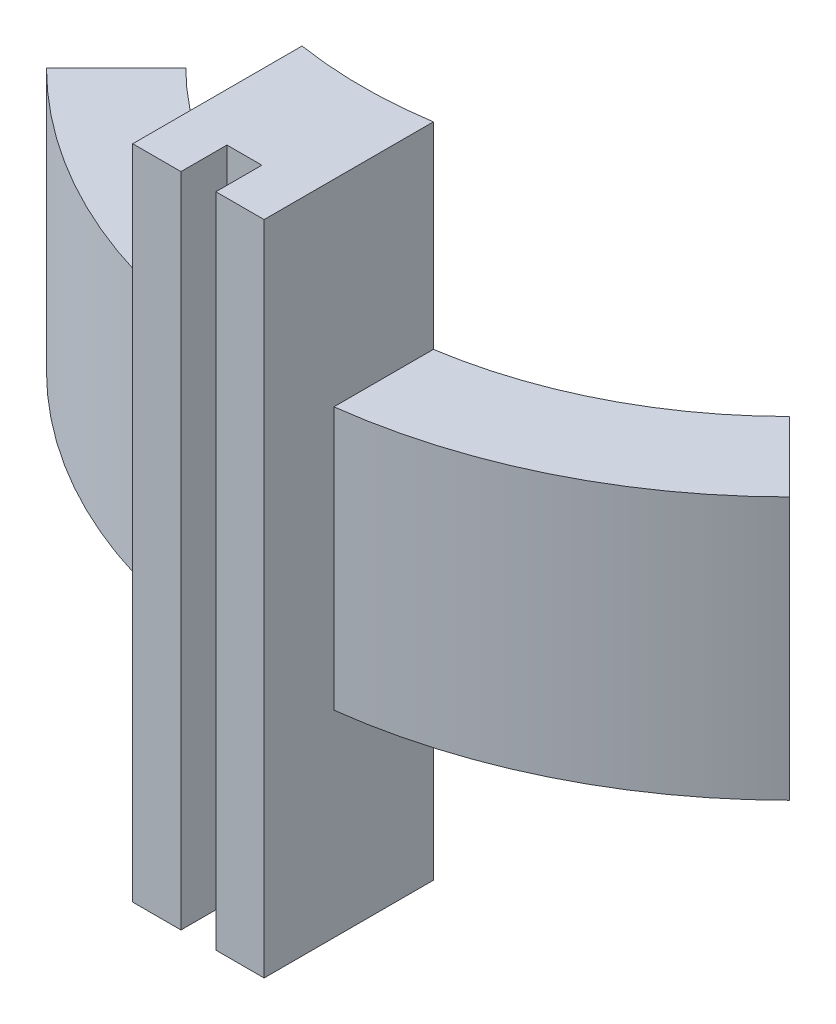
ISO-10303-21;
HEADER;
FILE_DESCRIPTION(('STEP AP214'),'2;1');
FILE_NAME('part.step','',(''),(''),'','','');
FILE_SCHEMA(('AUTOMOTIVE_DESIGN { 1 0 10303 214 1 1 1 1 }'));
ENDSEC;
DATA;
#1=APPLICATION_CONTEXT('core data for automotive mechanical design processes');
#2=APPLICATION_PROTOCOL_DEFINITION('international standard','automotive_design',2000,#1);
#3=PRODUCT_CONTEXT('',#1,'mechanical');
#4=PRODUCT('Part','Part','',(#3));
#5=PRODUCT_RELATED_PRODUCT_CATEGORY('part','',(#4));
#6=PRODUCT_DEFINITION_FORMATION('','',#4);
#7=PRODUCT_DEFINITION_CONTEXT('part definition',#1,'design');
#8=PRODUCT_DEFINITION('design','',#6,#7);
#9=PRODUCT_DEFINITION_SHAPE('','',#8);
#10=(LENGTH_UNIT() NAMED_UNIT(*) SI_UNIT(.MILLI.,.METRE.));
#11=(NAMED_UNIT(*) PLANE_ANGLE_UNIT() SI_UNIT($,.RADIAN.));
#12=(NAMED_UNIT(*) SI_UNIT($,.STERADIAN.) SOLID_ANGLE_UNIT());
#13=UNCERTAINTY_MEASURE_WITH_UNIT(LENGTH_MEASURE(1.E-05),#10,'distance_accuracy_value','');
#14=(GEOMETRIC_REPRESENTATION_CONTEXT(3) GLOBAL_UNCERTAINTY_ASSIGNED_CONTEXT((#13)) GLOBAL_UNIT_ASSIGNED_CONTEXT((#10,
#11,#12)) REPRESENTATION_CONTEXT('',''));
#15=CARTESIAN_POINT('',(0.,0.,0.));
#16=DIRECTION('',(0.,0.,1.));
#17=DIRECTION('',(1.,0.,0.));
#18=AXIS2_PLACEMENT_3D('',#15,#16,#17);
#19=CARTESIAN_POINT('',(0.,-10.,0.));
#20=DIRECTION('',(0.,1.,0.));
#21=DIRECTION('',(0.,0.,1.));
#22=AXIS2_PLACEMENT_3D('',#19,#20,#21);
#23=CYLINDRICAL_SURFACE('',#22,40.);
#24=CARTESIAN_POINT('',(0.,10.,0.));
#25=DIRECTION('',(0.,1.,0.));
#26=DIRECTION('',(0.,0.,1.));
#27=AXIS2_PLACEMENT_3D('',#24,#25,#26);
#28=CIRCLE('',#27,40.);
#29=CARTESIAN_POINT('',(5.,10.,39.6862696659689));
#30=VERTEX_POINT('',#29);
#31=CARTESIAN_POINT('',(28.2842732378177,10.,28.284269257106));
#32=VERTEX_POINT('',#31);
#33=EDGE_CURVE('E284',#30,#32,#28,.T.);
#34=ORIENTED_EDGE('',*,*,#33,.F.);
#35=DIRECTION('',(0.,1.,0.));
#36=VECTOR('',#35,1.);
#37=CARTESIAN_POINT('',(5.,-10.,39.6862696659689));
#38=LINE('',#37,#36);
#39=CARTESIAN_POINT('',(5.,-10.,39.6862696659689));
#40=VERTEX_POINT('',#39);
#41=EDGE_CURVE('E269',#30,#40,#38,.F.);
#42=ORIENTED_EDGE('',*,*,#41,.T.);
#43=CARTESIAN_POINT('',(0.,-10.,0.));
#44=DIRECTION('',(0.,1.,0.));
#45=DIRECTION('',(0.,0.,1.));
#46=AXIS2_PLACEMENT_3D('',#43,#44,#45);
#47=CIRCLE('',#46,40.);
#48=CARTESIAN_POINT('',(28.2842732378177,-10.,28.284269257106));
#49=VERTEX_POINT('',#48);
#50=EDGE_CURVE('E300',#40,#49,#47,.T.);
#51=ORIENTED_EDGE('',*,*,#50,.T.);
#52=DIRECTION('',(0.,1.,0.));
#53=VECTOR('',#52,1.);
#54=CARTESIAN_POINT('',(28.2842732378177,-10.,28.284269257106));
#55=LINE('',#54,#53);
#56=EDGE_CURVE('E314',#49,#32,#55,.T.);
#57=ORIENTED_EDGE('',*,*,#56,.T.);
#58=EDGE_LOOP('',(#34,#42,#51,#57));
#59=FACE_BOUND('',#58,.T.);
#60=ADVANCED_FACE('F49',(#59),#23,.T.);
#61=CARTESIAN_POINT('',(0.,-10.,0.));
#62=DIRECTION('',(0.,1.,0.));
#63=DIRECTION('',(0.,0.,1.));
#64=AXIS2_PLACEMENT_3D('',#61,#62,#63);
#65=PLANE('',#64);
#66=DIRECTION('',(0.,0.,1.));
#67=VECTOR('',#66,1.);
#68=CARTESIAN_POINT('',(5.,-10.,0.));
#69=LINE('',#68,#67);
#70=CARTESIAN_POINT('',(5.,-10.,32.1130814466629));
#71=VERTEX_POINT('',#70);
#72=EDGE_CURVE('E273',#71,#40,#69,.T.);
#73=ORIENTED_EDGE('',*,*,#72,.F.);
#74=CARTESIAN_POINT('',(0.,-10.,0.));
#75=DIRECTION('',(0.,1.,0.));
#76=DIRECTION('',(0.,0.,1.));
#77=AXIS2_PLACEMENT_3D('',#74,#75,#76);
#78=CIRCLE('',#77,32.5);
#79=CARTESIAN_POINT('',(22.9809723789186,-10.,22.9809683982068));
#80=VERTEX_POINT('',#79);
#81=EDGE_CURVE('E73',#71,#80,#78,.T.);
#82=ORIENTED_EDGE('',*,*,#81,.T.);
#83=DIRECTION('',(-0.707106781186544,0.,-0.707106781186551));
#84=VECTOR('',#83,1.);
#85=CARTESIAN_POINT('',(1.9903560356063E-06,-10.,-1.99035603560628E-06));
#86=LINE('',#85,#84);
#87=EDGE_CURVE('E305',#49,#80,#86,.T.);
#88=ORIENTED_EDGE('',*,*,#87,.F.);
#89=ORIENTED_EDGE('',*,*,#50,.F.);
#90=EDGE_LOOP('',(#73,#82,#88,#89));
#91=FACE_BOUND('',#90,.T.);
#92=ADVANCED_FACE('F368',(#91),#65,.F.);
#93=CARTESIAN_POINT('',(0.,10.,0.));
#94=DIRECTION('',(0.,1.,0.));
#95=DIRECTION('',(0.,0.,1.));
#96=AXIS2_PLACEMENT_3D('',#93,#94,#95);
#97=PLANE('',#96);
#98=CARTESIAN_POINT('',(0.,10.,0.));
#99=DIRECTION('',(0.,1.,0.));
#100=DIRECTION('',(0.,0.,1.));
#101=AXIS2_PLACEMENT_3D('',#98,#99,#100);
#102=CIRCLE('',#101,32.5);
#103=CARTESIAN_POINT('',(5.,10.,32.1130814466629));
#104=VERTEX_POINT('',#103);
#105=CARTESIAN_POINT('',(22.9809723789186,10.,22.9809683982068));
#106=VERTEX_POINT('',#105);
#107=EDGE_CURVE('E276',#104,#106,#102,.T.);
#108=ORIENTED_EDGE('',*,*,#107,.F.);
#109=DIRECTION('',(0.,0.,1.));
#110=VECTOR('',#109,1.);
#111=CARTESIAN_POINT('',(5.,10.,0.));
#112=LINE('',#111,#110);
#113=EDGE_CURVE('E11',#104,#30,#112,.T.);
#114=ORIENTED_EDGE('',*,*,#113,.T.);
#115=ORIENTED_EDGE('',*,*,#33,.T.);
#116=DIRECTION('',(-0.707106781186544,0.,-0.707106781186551));
#117=VECTOR('',#116,1.);
#118=CARTESIAN_POINT('',(1.9903560356063E-06,10.,-1.99035603560628E-06));
#119=LINE('',#118,#117);
#120=EDGE_CURVE('E289',#32,#106,#119,.T.);
#121=ORIENTED_EDGE('',*,*,#120,.T.);
#122=EDGE_LOOP('',(#108,#114,#115,#121));
#123=FACE_BOUND('',#122,.T.);
#124=ADVANCED_FACE('F378',(#123),#97,.T.);
#125=CARTESIAN_POINT('',(0.,-10.,0.));
#126=DIRECTION('',(0.,1.,0.));
#127=DIRECTION('',(0.,0.,1.));
#128=AXIS2_PLACEMENT_3D('',#125,#126,#127);
#129=CYLINDRICAL_SURFACE('',#128,32.5);
#130=CARTESIAN_POINT('',(-22.9809703885628,10.,22.980970388563));
#131=VERTEX_POINT('',#130);
#132=CARTESIAN_POINT('',(-5.00000000000001,10.,32.1130814466629));
#133=VERTEX_POINT('',#132);
#134=EDGE_CURVE('E277',#131,#133,#102,.T.);
#135=ORIENTED_EDGE('',*,*,#134,.T.);
#136=DIRECTION('',(0.,1.,0.));
#137=VECTOR('',#136,1.);
#138=CARTESIAN_POINT('',(-5.00000000000001,-25.,32.1130814466629));
#139=LINE('',#138,#137);
#140=CARTESIAN_POINT('',(-5.00000000000001,25.,32.1130814466629));
#141=VERTEX_POINT('',#140);
#142=EDGE_CURVE('E185',#133,#141,#139,.T.);
#143=ORIENTED_EDGE('',*,*,#142,.T.);
#144=CARTESIAN_POINT('',(0.,25.,-2.8796409701215E-13));
#145=DIRECTION('',(0.,1.,0.));
#146=DIRECTION('',(0.,0.,1.));
#147=AXIS2_PLACEMENT_3D('',#144,#145,#146);
#148=CIRCLE('',#147,32.5000000000003);
#149=CARTESIAN_POINT('',(5.,25.,32.1130814466629));
#150=VERTEX_POINT('',#149);
#151=EDGE_CURVE('E178',#141,#150,#148,.T.);
#152=ORIENTED_EDGE('',*,*,#151,.T.);
#153=DIRECTION('',(0.,1.,0.));
#154=VECTOR('',#153,1.);
#155=CARTESIAN_POINT('',(5.,-25.,32.1130814466629));
#156=LINE('',#155,#154);
#157=EDGE_CURVE('E65',#104,#150,#156,.T.);
#158=ORIENTED_EDGE('',*,*,#157,.F.);
#159=ORIENTED_EDGE('',*,*,#107,.T.);
#160=DIRECTION('',(0.,1.,0.));
#161=VECTOR('',#160,1.);
#162=CARTESIAN_POINT('',(22.9809723789186,-10.,22.9809683982068));
#163=LINE('',#162,#161);
#164=EDGE_CURVE('E310',#80,#106,#163,.T.);
#165=ORIENTED_EDGE('',*,*,#164,.F.);
#166=ORIENTED_EDGE('',*,*,#81,.F.);
#167=CARTESIAN_POINT('',(5.,-25.,32.1130814466629));
#168=VERTEX_POINT('',#167);
#169=EDGE_CURVE('E170',#168,#71,#156,.T.);
#170=ORIENTED_EDGE('',*,*,#169,.F.);
#171=CARTESIAN_POINT('',(0.,-25.,-2.8796409701215E-13));
#172=DIRECTION('',(0.,1.,0.));
#173=DIRECTION('',(0.,0.,1.));
#174=AXIS2_PLACEMENT_3D('',#171,#172,#173);
#175=CIRCLE('',#174,32.5000000000003);
#176=CARTESIAN_POINT('',(-5.00000000000001,-25.,32.1130814466629));
#177=VERTEX_POINT('',#176);
#178=EDGE_CURVE('E214',#177,#168,#175,.T.);
#179=ORIENTED_EDGE('',*,*,#178,.F.);
#180=CARTESIAN_POINT('',(-5.00000000000001,-10.,32.1130814466629));
#181=VERTEX_POINT('',#180);
#182=EDGE_CURVE('E258',#177,#181,#139,.T.);
#183=ORIENTED_EDGE('',*,*,#182,.T.);
#184=CARTESIAN_POINT('',(-22.9809703885628,-10.,22.980970388563));
#185=VERTEX_POINT('',#184);
#186=EDGE_CURVE('E293',#185,#181,#78,.T.);
#187=ORIENTED_EDGE('',*,*,#186,.F.);
#188=DIRECTION('',(0.,1.,0.));
#189=VECTOR('',#188,1.);
#190=CARTESIAN_POINT('',(-22.9809703885628,-10.,22.980970388563));
#191=LINE('',#190,#189);
#192=EDGE_CURVE('E309',#185,#131,#191,.T.);
#193=ORIENTED_EDGE('',*,*,#192,.T.);
#194=EDGE_LOOP('',(#135,#143,#152,#158,#159,#165,#166,#170,#179,#183,#187,#193));
#195=FACE_BOUND('',#194,.T.);
#196=ADVANCED_FACE('F51',(#195),#129,.F.);
#197=CARTESIAN_POINT('',(1.9903560356063E-06,-10.,-1.99035603560628E-06));
#198=DIRECTION('',(0.707106781186551,0.,-0.707106781186544));
#199=DIRECTION('',(-0.707106781186544,0.,-0.707106781186551));
#200=AXIS2_PLACEMENT_3D('',#197,#198,#199);
#201=PLANE('',#200);
#202=ORIENTED_EDGE('',*,*,#164,.T.);
#203=ORIENTED_EDGE('',*,*,#120,.F.);
#204=ORIENTED_EDGE('',*,*,#56,.F.);
#205=ORIENTED_EDGE('',*,*,#87,.T.);
#206=EDGE_LOOP('',(#202,#203,#204,#205));
#207=FACE_BOUND('',#206,.T.);
#208=ADVANCED_FACE('F376',(#207),#201,.T.);
#209=DIRECTION('',(0.,1.,0.));
#210=VECTOR('',#209,1.);
#211=CARTESIAN_POINT('',(-5.,-10.,39.6862696659689));
#212=LINE('',#211,#210);
#213=CARTESIAN_POINT('',(-5.,10.,39.6862696659689));
#214=VERTEX_POINT('',#213);
#215=CARTESIAN_POINT('',(-5.,-10.,39.6862696659689));
#216=VERTEX_POINT('',#215);
#217=EDGE_CURVE('E242',#214,#216,#212,.F.);
#218=ORIENTED_EDGE('',*,*,#217,.F.);
#219=CARTESIAN_POINT('',(-28.2842712474619,10.,28.2842712474622));
#220=VERTEX_POINT('',#219);
#221=EDGE_CURVE('E285',#220,#214,#28,.T.);
#222=ORIENTED_EDGE('',*,*,#221,.F.);
#223=DIRECTION('',(0.,1.,0.));
#224=VECTOR('',#223,1.);
#225=CARTESIAN_POINT('',(-28.2842712474619,-10.,28.2842712474622));
#226=LINE('',#225,#224);
#227=CARTESIAN_POINT('',(-28.2842712474619,-10.,28.2842712474622));
#228=VERTEX_POINT('',#227);
#229=EDGE_CURVE('E318',#228,#220,#226,.T.);
#230=ORIENTED_EDGE('',*,*,#229,.F.);
#231=EDGE_CURVE('E301',#228,#216,#47,.T.);
#232=ORIENTED_EDGE('',*,*,#231,.T.);
#233=EDGE_LOOP('',(#218,#222,#230,#232));
#234=FACE_BOUND('',#233,.T.);
#235=ADVANCED_FACE('F331',(#234),#23,.T.);
#236=CARTESIAN_POINT('',(0.,-10.,0.));
#237=DIRECTION('',(0.707106781186551,0.,0.707106781186544));
#238=DIRECTION('',(0.707106781186544,0.,-0.707106781186551));
#239=AXIS2_PLACEMENT_3D('',#236,#237,#238);
#240=PLANE('',#239);
#241=ORIENTED_EDGE('',*,*,#229,.T.);
#242=DIRECTION('',(0.707106781186544,0.,-0.707106781186551));
#243=VECTOR('',#242,1.);
#244=CARTESIAN_POINT('',(0.,10.,0.));
#245=LINE('',#244,#243);
#246=EDGE_CURVE('E280',#220,#131,#245,.T.);
#247=ORIENTED_EDGE('',*,*,#246,.T.);
#248=ORIENTED_EDGE('',*,*,#192,.F.);
#249=DIRECTION('',(0.707106781186544,0.,-0.707106781186551));
#250=VECTOR('',#249,1.);
#251=CARTESIAN_POINT('',(0.,-10.,0.));
#252=LINE('',#251,#250);
#253=EDGE_CURVE('E297',#228,#185,#252,.T.);
#254=ORIENTED_EDGE('',*,*,#253,.F.);
#255=EDGE_LOOP('',(#241,#247,#248,#254));
#256=FACE_BOUND('',#255,.T.);
#257=ADVANCED_FACE('F337',(#256),#240,.F.);
#258=ORIENTED_EDGE('',*,*,#186,.T.);
#259=DIRECTION('',(0.,0.,1.));
#260=VECTOR('',#259,1.);
#261=CARTESIAN_POINT('',(-5.00000000000004,-10.,0.));
#262=LINE('',#261,#260);
#263=EDGE_CURVE('E265',#181,#216,#262,.T.);
#264=ORIENTED_EDGE('',*,*,#263,.T.);
#265=ORIENTED_EDGE('',*,*,#231,.F.);
#266=ORIENTED_EDGE('',*,*,#253,.T.);
#267=EDGE_LOOP('',(#258,#264,#265,#266));
#268=FACE_BOUND('',#267,.T.);
#269=ADVANCED_FACE('F341',(#268),#65,.F.);
#270=DIRECTION('',(0.,0.,1.));
#271=VECTOR('',#270,1.);
#272=CARTESIAN_POINT('',(-5.00000000000004,10.,0.));
#273=LINE('',#272,#271);
#274=EDGE_CURVE('E58',#133,#214,#273,.T.);
#275=ORIENTED_EDGE('',*,*,#274,.F.);
#276=ORIENTED_EDGE('',*,*,#134,.F.);
#277=ORIENTED_EDGE('',*,*,#246,.F.);
#278=ORIENTED_EDGE('',*,*,#221,.T.);
#279=EDGE_LOOP('',(#275,#276,#277,#278));
#280=FACE_BOUND('',#279,.T.);
#281=ADVANCED_FACE('F334',(#280),#97,.T.);
#282=CARTESIAN_POINT('',(5.,-25.,0.));
#283=DIRECTION('',(-1.,0.,0.));
#284=DIRECTION('',(0.,0.,1.));
#285=AXIS2_PLACEMENT_3D('',#282,#283,#284);
#286=PLANE('',#285);
#287=ORIENTED_EDGE('',*,*,#169,.T.);
#288=ORIENTED_EDGE('',*,*,#72,.T.);
#289=ORIENTED_EDGE('',*,*,#41,.F.);
#290=ORIENTED_EDGE('',*,*,#113,.F.);
#291=ORIENTED_EDGE('',*,*,#157,.T.);
#292=DIRECTION('',(0.,0.,1.));
#293=VECTOR('',#292,1.);
#294=CARTESIAN_POINT('',(5.,25.,0.));
#295=LINE('',#294,#293);
#296=CARTESIAN_POINT('',(5.,25.,45.));
#297=VERTEX_POINT('',#296);
#298=EDGE_CURVE('E167',#150,#297,#295,.T.);
#299=ORIENTED_EDGE('',*,*,#298,.T.);
#300=DIRECTION('',(0.,1.,0.));
#301=VECTOR('',#300,1.);
#302=CARTESIAN_POINT('',(5.,-25.,45.));
#303=LINE('',#302,#301);
#304=CARTESIAN_POINT('',(5.,-25.,45.));
#305=VERTEX_POINT('',#304);
#306=EDGE_CURVE('E239',#305,#297,#303,.T.);
#307=ORIENTED_EDGE('',*,*,#306,.F.);
#308=DIRECTION('',(0.,0.,1.));
#309=VECTOR('',#308,1.);
#310=CARTESIAN_POINT('',(5.,-25.,0.));
#311=LINE('',#310,#309);
#312=EDGE_CURVE('E211',#168,#305,#311,.T.);
#313=ORIENTED_EDGE('',*,*,#312,.F.);
#314=EDGE_LOOP('',(#287,#288,#289,#290,#291,#299,#307,#313));
#315=FACE_BOUND('',#314,.T.);
#316=ADVANCED_FACE('F165',(#315),#286,.F.);
#317=CARTESIAN_POINT('',(-5.00000000000004,-25.,0.));
#318=DIRECTION('',(-1.,0.,0.));
#319=DIRECTION('',(0.,0.,1.));
#320=AXIS2_PLACEMENT_3D('',#317,#318,#319);
#321=PLANE('',#320);
#322=ORIENTED_EDGE('',*,*,#263,.F.);
#323=ORIENTED_EDGE('',*,*,#182,.F.);
#324=DIRECTION('',(0.,0.,1.));
#325=VECTOR('',#324,1.);
#326=CARTESIAN_POINT('',(-5.00000000000004,-25.,0.));
#327=LINE('',#326,#325);
#328=CARTESIAN_POINT('',(-5.,-25.,45.));
#329=VERTEX_POINT('',#328);
#330=EDGE_CURVE('E217',#177,#329,#327,.T.);
#331=ORIENTED_EDGE('',*,*,#330,.T.);
#332=DIRECTION('',(0.,1.,0.));
#333=VECTOR('',#332,1.);
#334=CARTESIAN_POINT('',(-5.,-25.,45.));
#335=LINE('',#334,#333);
#336=CARTESIAN_POINT('',(-5.,25.,45.));
#337=VERTEX_POINT('',#336);
#338=EDGE_CURVE('E255',#329,#337,#335,.T.);
#339=ORIENTED_EDGE('',*,*,#338,.T.);
#340=DIRECTION('',(0.,0.,1.));
#341=VECTOR('',#340,1.);
#342=CARTESIAN_POINT('',(-5.00000000000004,25.,0.));
#343=LINE('',#342,#341);
#344=EDGE_CURVE('E188',#141,#337,#343,.T.);
#345=ORIENTED_EDGE('',*,*,#344,.F.);
#346=ORIENTED_EDGE('',*,*,#142,.F.);
#347=ORIENTED_EDGE('',*,*,#274,.T.);
#348=ORIENTED_EDGE('',*,*,#217,.T.);
#349=EDGE_LOOP('',(#322,#323,#331,#339,#345,#346,#347,#348));
#350=FACE_BOUND('',#349,.T.);
#351=ADVANCED_FACE('F326',(#350),#321,.T.);
#352=CARTESIAN_POINT('',(0.,-25.,45.));
#353=DIRECTION('',(0.,0.,1.));
#354=DIRECTION('',(1.,0.,0.));
#355=AXIS2_PLACEMENT_3D('',#352,#353,#354);
#356=PLANE('',#355);
#357=ORIENTED_EDGE('',*,*,#306,.T.);
#358=DIRECTION('',(1.,0.,0.));
#359=VECTOR('',#358,1.);
#360=CARTESIAN_POINT('',(0.,25.,45.));
#361=LINE('',#360,#359);
#362=CARTESIAN_POINT('',(1.3286093333421,25.,45.));
#363=VERTEX_POINT('',#362);
#364=EDGE_CURVE('E181',#363,#297,#361,.T.);
#365=ORIENTED_EDGE('',*,*,#364,.F.);
#366=DIRECTION('',(0.,1.,0.));
#367=VECTOR('',#366,1.);
#368=CARTESIAN_POINT('',(1.3286093333421,-25.,45.));
#369=LINE('',#368,#367);
#370=CARTESIAN_POINT('',(1.3286093333421,-25.,45.));
#371=VERTEX_POINT('',#370);
#372=EDGE_CURVE('E243',#371,#363,#369,.T.);
#373=ORIENTED_EDGE('',*,*,#372,.F.);
#374=DIRECTION('',(1.,0.,0.));
#375=VECTOR('',#374,1.);
#376=CARTESIAN_POINT('',(0.,-25.,45.));
#377=LINE('',#376,#375);
#378=EDGE_CURVE('E171',#371,#305,#377,.T.);
#379=ORIENTED_EDGE('',*,*,#378,.T.);
#380=EDGE_LOOP('',(#357,#365,#373,#379));
#381=FACE_BOUND('',#380,.T.);
#382=ADVANCED_FACE('F366',(#381),#356,.T.);
#383=CARTESIAN_POINT('',(1.32860933334208,-25.,0.));
#384=DIRECTION('',(1.,0.,0.));
#385=DIRECTION('',(0.,0.,-1.));
#386=AXIS2_PLACEMENT_3D('',#383,#384,#385);
#387=PLANE('',#386);
#388=ORIENTED_EDGE('',*,*,#372,.T.);
#389=DIRECTION('',(0.,0.,-1.));
#390=VECTOR('',#389,1.);
#391=CARTESIAN_POINT('',(1.32860933334208,25.,0.));
#392=LINE('',#391,#390);
#393=CARTESIAN_POINT('',(1.32860933334209,25.,41.5));
#394=VERTEX_POINT('',#393);
#395=EDGE_CURVE('E205',#363,#394,#392,.T.);
#396=ORIENTED_EDGE('',*,*,#395,.T.);
#397=DIRECTION('',(0.,1.,0.));
#398=VECTOR('',#397,1.);
#399=CARTESIAN_POINT('',(1.32860933334209,-25.,41.5));
#400=LINE('',#399,#398);
#401=CARTESIAN_POINT('',(1.32860933334209,-25.,41.5));
#402=VERTEX_POINT('',#401);
#403=EDGE_CURVE('E246',#402,#394,#400,.T.);
#404=ORIENTED_EDGE('',*,*,#403,.F.);
#405=DIRECTION('',(0.,0.,-1.));
#406=VECTOR('',#405,1.);
#407=CARTESIAN_POINT('',(1.32860933334208,-25.,0.));
#408=LINE('',#407,#406);
#409=EDGE_CURVE('E233',#371,#402,#408,.T.);
#410=ORIENTED_EDGE('',*,*,#409,.F.);
#411=EDGE_LOOP('',(#388,#396,#404,#410));
#412=FACE_BOUND('',#411,.T.);
#413=ADVANCED_FACE('F364',(#412),#387,.F.);
#414=CARTESIAN_POINT('',(0.,-25.,41.5));
#415=DIRECTION('',(0.,0.,1.));
#416=DIRECTION('',(1.,0.,0.));
#417=AXIS2_PLACEMENT_3D('',#414,#415,#416);
#418=PLANE('',#417);
#419=ORIENTED_EDGE('',*,*,#403,.T.);
#420=DIRECTION('',(1.,0.,0.));
#421=VECTOR('',#420,1.);
#422=CARTESIAN_POINT('',(0.,25.,41.5));
#423=LINE('',#422,#421);
#424=CARTESIAN_POINT('',(-1.32860933334209,25.,41.5));
#425=VERTEX_POINT('',#424);
#426=EDGE_CURVE('E201',#425,#394,#423,.T.);
#427=ORIENTED_EDGE('',*,*,#426,.F.);
#428=DIRECTION('',(0.,1.,0.));
#429=VECTOR('',#428,1.);
#430=CARTESIAN_POINT('',(-1.32860933334209,-25.,41.5));
#431=LINE('',#430,#429);
#432=CARTESIAN_POINT('',(-1.32860933334209,-25.,41.5));
#433=VERTEX_POINT('',#432);
#434=EDGE_CURVE('E249',#433,#425,#431,.T.);
#435=ORIENTED_EDGE('',*,*,#434,.F.);
#436=DIRECTION('',(1.,0.,0.));
#437=VECTOR('',#436,1.);
#438=CARTESIAN_POINT('',(0.,-25.,41.5));
#439=LINE('',#438,#437);
#440=EDGE_CURVE('E229',#433,#402,#439,.T.);
#441=ORIENTED_EDGE('',*,*,#440,.T.);
#442=EDGE_LOOP('',(#419,#427,#435,#441));
#443=FACE_BOUND('',#442,.T.);
#444=ADVANCED_FACE('F361',(#443),#418,.T.);
#445=CARTESIAN_POINT('',(-1.32860933334209,-25.,0.));
#446=DIRECTION('',(1.,0.,0.));
#447=DIRECTION('',(0.,0.,-1.));
#448=AXIS2_PLACEMENT_3D('',#445,#446,#447);
#449=PLANE('',#448);
#450=ORIENTED_EDGE('',*,*,#434,.T.);
#451=DIRECTION('',(0.,0.,-1.));
#452=VECTOR('',#451,1.);
#453=CARTESIAN_POINT('',(-1.32860933334209,25.,0.));
#454=LINE('',#453,#452);
#455=CARTESIAN_POINT('',(-1.32860933334209,25.,45.));
#456=VERTEX_POINT('',#455);
#457=EDGE_CURVE('E197',#456,#425,#454,.T.);
#458=ORIENTED_EDGE('',*,*,#457,.F.);
#459=DIRECTION('',(0.,1.,0.));
#460=VECTOR('',#459,1.);
#461=CARTESIAN_POINT('',(-1.32860933334209,-25.,45.));
#462=LINE('',#461,#460);
#463=CARTESIAN_POINT('',(-1.32860933334209,-25.,45.));
#464=VERTEX_POINT('',#463);
#465=EDGE_CURVE('E252',#464,#456,#462,.T.);
#466=ORIENTED_EDGE('',*,*,#465,.F.);
#467=DIRECTION('',(0.,0.,-1.));
#468=VECTOR('',#467,1.);
#469=CARTESIAN_POINT('',(-1.32860933334209,-25.,0.));
#470=LINE('',#469,#468);
#471=EDGE_CURVE('E225',#464,#433,#470,.T.);
#472=ORIENTED_EDGE('',*,*,#471,.T.);
#473=EDGE_LOOP('',(#450,#458,#466,#472));
#474=FACE_BOUND('',#473,.T.);
#475=ADVANCED_FACE('F355',(#474),#449,.T.);
#476=CARTESIAN_POINT('',(0.,-25.,45.));
#477=DIRECTION('',(0.,0.,1.));
#478=DIRECTION('',(1.,0.,0.));
#479=AXIS2_PLACEMENT_3D('',#476,#477,#478);
#480=PLANE('',#479);
#481=ORIENTED_EDGE('',*,*,#465,.T.);
#482=DIRECTION('',(1.,0.,0.));
#483=VECTOR('',#482,1.);
#484=CARTESIAN_POINT('',(0.,25.,45.));
#485=LINE('',#484,#483);
#486=EDGE_CURVE('E191',#337,#456,#485,.T.);
#487=ORIENTED_EDGE('',*,*,#486,.F.);
#488=ORIENTED_EDGE('',*,*,#338,.F.);
#489=DIRECTION('',(1.,0.,0.));
#490=VECTOR('',#489,1.);
#491=CARTESIAN_POINT('',(0.,-25.,45.));
#492=LINE('',#491,#490);
#493=EDGE_CURVE('E221',#329,#464,#492,.T.);
#494=ORIENTED_EDGE('',*,*,#493,.T.);
#495=EDGE_LOOP('',(#481,#487,#488,#494));
#496=FACE_BOUND('',#495,.T.);
#497=ADVANCED_FACE('F353',(#496),#480,.T.);
#498=CARTESIAN_POINT('',(0.,-25.,0.));
#499=DIRECTION('',(0.,1.,0.));
#500=DIRECTION('',(0.,0.,1.));
#501=AXIS2_PLACEMENT_3D('',#498,#499,#500);
#502=PLANE('',#501);
#503=ORIENTED_EDGE('',*,*,#312,.T.);
#504=ORIENTED_EDGE('',*,*,#378,.F.);
#505=ORIENTED_EDGE('',*,*,#409,.T.);
#506=ORIENTED_EDGE('',*,*,#440,.F.);
#507=ORIENTED_EDGE('',*,*,#471,.F.);
#508=ORIENTED_EDGE('',*,*,#493,.F.);
#509=ORIENTED_EDGE('',*,*,#330,.F.);
#510=ORIENTED_EDGE('',*,*,#178,.T.);
#511=EDGE_LOOP('',(#503,#504,#505,#506,#507,#508,#509,#510));
#512=FACE_BOUND('',#511,.T.);
#513=ADVANCED_FACE('F348',(#512),#502,.F.);
#514=CARTESIAN_POINT('',(0.,25.,0.));
#515=DIRECTION('',(0.,1.,0.));
#516=DIRECTION('',(0.,0.,1.));
#517=AXIS2_PLACEMENT_3D('',#514,#515,#516);
#518=PLANE('',#517);
#519=ORIENTED_EDGE('',*,*,#298,.F.);
#520=ORIENTED_EDGE('',*,*,#151,.F.);
#521=ORIENTED_EDGE('',*,*,#344,.T.);
#522=ORIENTED_EDGE('',*,*,#486,.T.);
#523=ORIENTED_EDGE('',*,*,#457,.T.);
#524=ORIENTED_EDGE('',*,*,#426,.T.);
#525=ORIENTED_EDGE('',*,*,#395,.F.);
#526=ORIENTED_EDGE('',*,*,#364,.T.);
#527=EDGE_LOOP('',(#519,#520,#521,#522,#523,#524,#525,#526));
#528=FACE_BOUND('',#527,.T.);
#529=ADVANCED_FACE('F176',(#528),#518,.T.);
#530=CLOSED_SHELL('',(#60,#92,#124,#196,#208,#235,#257,#269,#281,#316,#351,#382,#413,#444,#475,
#497,#513,#529));
#531=MANIFOLD_SOLID_BREP('B2',#530);
#532=ADVANCED_BREP_SHAPE_REPRESENTATION('',(#18,#531),#14);
#533=SHAPE_DEFINITION_REPRESENTATION(#9,#532);
ENDSEC;
END-ISO-10303-21;
